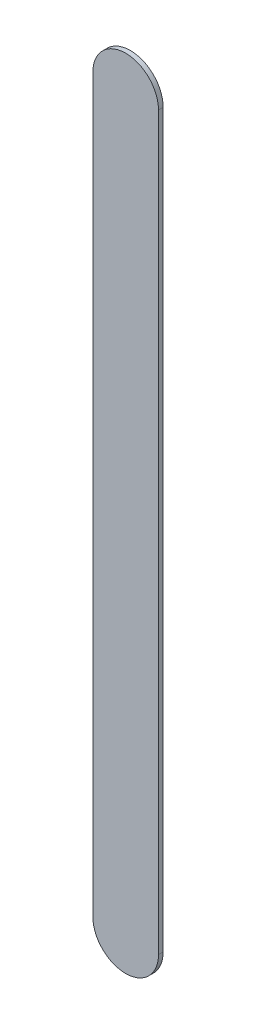
ISO-10303-21;
HEADER;
FILE_DESCRIPTION(('STEP AP214'),'2;1');
FILE_NAME('part.step','',(''),(''),'','','');
FILE_SCHEMA(('AUTOMOTIVE_DESIGN { 1 0 10303 214 1 1 1 1 }'));
ENDSEC;
DATA;
#1=APPLICATION_CONTEXT('core data for automotive mechanical design processes');
#2=APPLICATION_PROTOCOL_DEFINITION('international standard','automotive_design',2000,#1);
#3=PRODUCT_CONTEXT('',#1,'mechanical');
#4=PRODUCT('Part','Part','',(#3));
#5=PRODUCT_RELATED_PRODUCT_CATEGORY('part','',(#4));
#6=PRODUCT_DEFINITION_FORMATION('','',#4);
#7=PRODUCT_DEFINITION_CONTEXT('part definition',#1,'design');
#8=PRODUCT_DEFINITION('design','',#6,#7);
#9=PRODUCT_DEFINITION_SHAPE('','',#8);
#10=(LENGTH_UNIT() NAMED_UNIT(*) SI_UNIT(.MILLI.,.METRE.));
#11=(NAMED_UNIT(*) PLANE_ANGLE_UNIT() SI_UNIT($,.RADIAN.));
#12=(NAMED_UNIT(*) SI_UNIT($,.STERADIAN.) SOLID_ANGLE_UNIT());
#13=UNCERTAINTY_MEASURE_WITH_UNIT(LENGTH_MEASURE(1.E-05),#10,'distance_accuracy_value','');
#14=(GEOMETRIC_REPRESENTATION_CONTEXT(3) GLOBAL_UNCERTAINTY_ASSIGNED_CONTEXT((#13)) GLOBAL_UNIT_ASSIGNED_CONTEXT((#10,
#11,#12)) REPRESENTATION_CONTEXT('',''));
#15=CARTESIAN_POINT('',(0.,0.,0.));
#16=DIRECTION('',(0.,0.,1.));
#17=DIRECTION('',(1.,0.,0.));
#18=AXIS2_PLACEMENT_3D('',#15,#16,#17);
#19=CARTESIAN_POINT('',(95.85401454,101.29598486,0.));
#20=DIRECTION('',(-1.,0.,0.));
#21=DIRECTION('',(0.,1.,0.));
#22=AXIS2_PLACEMENT_3D('',#19,#20,#21);
#23=PLANE('',#22);
#24=DIRECTION('',(0.,1.,0.));
#25=VECTOR('',#24,1.);
#26=CARTESIAN_POINT('',(95.85401454,101.29598486,0.03556));
#27=LINE('',#26,#25);
#28=CARTESIAN_POINT('',(95.85401454,101.29598486,0.03556));
#29=VERTEX_POINT('',#28);
#30=CARTESIAN_POINT('',(95.85401454,106.86842482,0.03556));
#31=VERTEX_POINT('',#30);
#32=EDGE_CURVE('E11',#29,#31,#27,.T.);
#33=ORIENTED_EDGE('',*,*,#32,.F.);
#34=DIRECTION('',(0.,0.,1.));
#35=VECTOR('',#34,1.);
#36=CARTESIAN_POINT('',(95.85401454,101.29598486,0.));
#37=LINE('',#36,#35);
#38=CARTESIAN_POINT('',(95.85401454,101.29598486,0.));
#39=VERTEX_POINT('',#38);
#40=EDGE_CURVE('E24',#39,#29,#37,.T.);
#41=ORIENTED_EDGE('',*,*,#40,.F.);
#42=DIRECTION('',(0.,1.,0.));
#43=VECTOR('',#42,1.);
#44=CARTESIAN_POINT('',(95.85401454,101.29598486,0.));
#45=LINE('',#44,#43);
#46=CARTESIAN_POINT('',(95.85401454,106.86842482,0.));
#47=VERTEX_POINT('',#46);
#48=EDGE_CURVE('E75',#39,#47,#45,.T.);
#49=ORIENTED_EDGE('',*,*,#48,.T.);
#50=DIRECTION('',(0.,0.,1.));
#51=VECTOR('',#50,1.);
#52=CARTESIAN_POINT('',(95.85401454,106.86842482,0.));
#53=LINE('',#52,#51);
#54=EDGE_CURVE('E37',#47,#31,#53,.T.);
#55=ORIENTED_EDGE('',*,*,#54,.T.);
#56=EDGE_LOOP('',(#33,#41,#49,#55));
#57=FACE_BOUND('',#56,.T.);
#58=ADVANCED_FACE('F17',(#57),#23,.F.);
#59=CARTESIAN_POINT('',(95.60401504,106.86842482,0.));
#60=DIRECTION('',(0.,0.,-1.));
#61=DIRECTION('',(1.,0.,0.));
#62=AXIS2_PLACEMENT_3D('',#59,#60,#61);
#63=CYLINDRICAL_SURFACE('',#62,0.249999500000001);
#64=CARTESIAN_POINT('',(95.60401504,106.86842482,0.03556));
#65=DIRECTION('',(0.,0.,1.));
#66=DIRECTION('',(1.,0.,0.));
#67=AXIS2_PLACEMENT_3D('',#64,#65,#66);
#68=CIRCLE('',#67,0.249999500000001);
#69=CARTESIAN_POINT('',(95.35401554,106.86842482,0.03556));
#70=VERTEX_POINT('',#69);
#71=EDGE_CURVE('E83',#31,#70,#68,.T.);
#72=ORIENTED_EDGE('',*,*,#71,.F.);
#73=ORIENTED_EDGE('',*,*,#54,.F.);
#74=CARTESIAN_POINT('',(95.60401504,106.86842482,0.));
#75=DIRECTION('',(0.,0.,1.));
#76=DIRECTION('',(1.,0.,0.));
#77=AXIS2_PLACEMENT_3D('',#74,#75,#76);
#78=CIRCLE('',#77,0.249999500000001);
#79=CARTESIAN_POINT('',(95.35401554,106.86842482,0.));
#80=VERTEX_POINT('',#79);
#81=EDGE_CURVE('E81',#47,#80,#78,.T.);
#82=ORIENTED_EDGE('',*,*,#81,.T.);
#83=DIRECTION('',(0.,0.,1.));
#84=VECTOR('',#83,1.);
#85=CARTESIAN_POINT('',(95.35401554,106.86842482,0.));
#86=LINE('',#85,#84);
#87=EDGE_CURVE('E67',#80,#70,#86,.T.);
#88=ORIENTED_EDGE('',*,*,#87,.T.);
#89=EDGE_LOOP('',(#72,#73,#82,#88));
#90=FACE_BOUND('',#89,.T.);
#91=ADVANCED_FACE('F89',(#90),#63,.T.);
#92=CARTESIAN_POINT('',(95.35401554,106.86842482,0.));
#93=DIRECTION('',(1.,0.,0.));
#94=DIRECTION('',(0.,-1.,0.));
#95=AXIS2_PLACEMENT_3D('',#92,#93,#94);
#96=PLANE('',#95);
#97=DIRECTION('',(0.,-1.,0.));
#98=VECTOR('',#97,1.);
#99=CARTESIAN_POINT('',(95.35401554,106.86842482,0.03556));
#100=LINE('',#99,#98);
#101=CARTESIAN_POINT('',(95.35401554,101.29598486,0.03556));
#102=VERTEX_POINT('',#101);
#103=EDGE_CURVE('E71',#70,#102,#100,.T.);
#104=ORIENTED_EDGE('',*,*,#103,.F.);
#105=ORIENTED_EDGE('',*,*,#87,.F.);
#106=DIRECTION('',(0.,-1.,0.));
#107=VECTOR('',#106,1.);
#108=CARTESIAN_POINT('',(95.35401554,106.86842482,0.));
#109=LINE('',#108,#107);
#110=CARTESIAN_POINT('',(95.35401554,101.29598486,0.));
#111=VERTEX_POINT('',#110);
#112=EDGE_CURVE('E63',#80,#111,#109,.T.);
#113=ORIENTED_EDGE('',*,*,#112,.T.);
#114=DIRECTION('',(0.,0.,1.));
#115=VECTOR('',#114,1.);
#116=CARTESIAN_POINT('',(95.35401554,101.29598486,0.));
#117=LINE('',#116,#115);
#118=EDGE_CURVE('E53',#111,#102,#117,.T.);
#119=ORIENTED_EDGE('',*,*,#118,.T.);
#120=EDGE_LOOP('',(#104,#105,#113,#119));
#121=FACE_BOUND('',#120,.T.);
#122=ADVANCED_FACE('F66',(#121),#96,.F.);
#123=CARTESIAN_POINT('',(95.60401504,101.29598486,0.));
#124=DIRECTION('',(0.,0.,-1.));
#125=DIRECTION('',(-1.,0.,0.));
#126=AXIS2_PLACEMENT_3D('',#123,#124,#125);
#127=CYLINDRICAL_SURFACE('',#126,0.249999500000001);
#128=CARTESIAN_POINT('',(95.60401504,101.29598486,0.03556));
#129=DIRECTION('',(0.,0.,1.));
#130=DIRECTION('',(-1.,0.,0.));
#131=AXIS2_PLACEMENT_3D('',#128,#129,#130);
#132=CIRCLE('',#131,0.249999500000001);
#133=EDGE_CURVE('E59',#102,#29,#132,.T.);
#134=ORIENTED_EDGE('',*,*,#133,.F.);
#135=ORIENTED_EDGE('',*,*,#118,.F.);
#136=CARTESIAN_POINT('',(95.60401504,101.29598486,0.));
#137=DIRECTION('',(0.,0.,1.));
#138=DIRECTION('',(-1.,0.,0.));
#139=AXIS2_PLACEMENT_3D('',#136,#137,#138);
#140=CIRCLE('',#139,0.249999500000001);
#141=EDGE_CURVE('E57',#111,#39,#140,.T.);
#142=ORIENTED_EDGE('',*,*,#141,.T.);
#143=ORIENTED_EDGE('',*,*,#40,.T.);
#144=EDGE_LOOP('',(#134,#135,#142,#143));
#145=FACE_BOUND('',#144,.T.);
#146=ADVANCED_FACE('F55',(#145),#127,.T.);
#147=CARTESIAN_POINT('',(95.85401454,101.29598486,0.));
#148=DIRECTION('',(0.,0.,-1.));
#149=DIRECTION('',(-1.,0.,0.));
#150=AXIS2_PLACEMENT_3D('',#147,#148,#149);
#151=PLANE('',#150);
#152=ORIENTED_EDGE('',*,*,#141,.F.);
#153=ORIENTED_EDGE('',*,*,#112,.F.);
#154=ORIENTED_EDGE('',*,*,#81,.F.);
#155=ORIENTED_EDGE('',*,*,#48,.F.);
#156=EDGE_LOOP('',(#152,#153,#154,#155));
#157=FACE_BOUND('',#156,.T.);
#158=ADVANCED_FACE('F74',(#157),#151,.T.);
#159=CARTESIAN_POINT('',(95.85401454,101.29598486,0.03556));
#160=DIRECTION('',(0.,0.,-1.));
#161=DIRECTION('',(-1.,0.,0.));
#162=AXIS2_PLACEMENT_3D('',#159,#160,#161);
#163=PLANE('',#162);
#164=ORIENTED_EDGE('',*,*,#32,.T.);
#165=ORIENTED_EDGE('',*,*,#71,.T.);
#166=ORIENTED_EDGE('',*,*,#103,.T.);
#167=ORIENTED_EDGE('',*,*,#133,.T.);
#168=EDGE_LOOP('',(#164,#165,#166,#167));
#169=FACE_BOUND('',#168,.T.);
#170=ADVANCED_FACE('F91',(#169),#163,.F.);
#171=CLOSED_SHELL('',(#58,#91,#122,#146,#158,#170));
#172=MANIFOLD_SOLID_BREP('B1',#171);
#173=ADVANCED_BREP_SHAPE_REPRESENTATION('',(#18,#172),#14);
#174=SHAPE_DEFINITION_REPRESENTATION(#9,#173);
ENDSEC;
END-ISO-10303-21;
